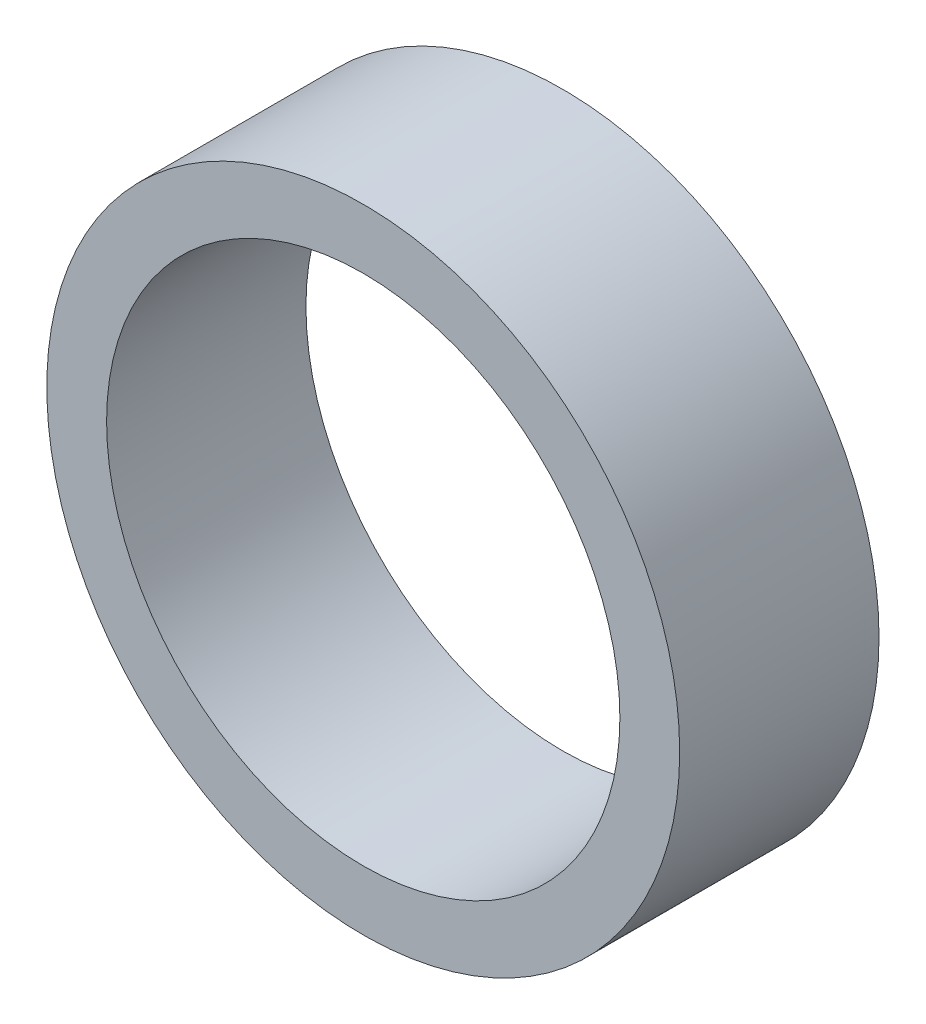
ISO-10303-21;
HEADER;
FILE_DESCRIPTION(('STEP AP214'),'2;1');
FILE_NAME('part.step','',(''),(''),'','','');
FILE_SCHEMA(('AUTOMOTIVE_DESIGN { 1 0 10303 214 1 1 1 1 }'));
ENDSEC;
DATA;
#1=APPLICATION_CONTEXT('core data for automotive mechanical design processes');
#2=APPLICATION_PROTOCOL_DEFINITION('international standard','automotive_design',2000,#1);
#3=PRODUCT_CONTEXT('',#1,'mechanical');
#4=PRODUCT('Part','Part','',(#3));
#5=PRODUCT_RELATED_PRODUCT_CATEGORY('part','',(#4));
#6=PRODUCT_DEFINITION_FORMATION('','',#4);
#7=PRODUCT_DEFINITION_CONTEXT('part definition',#1,'design');
#8=PRODUCT_DEFINITION('design','',#6,#7);
#9=PRODUCT_DEFINITION_SHAPE('','',#8);
#10=(LENGTH_UNIT() NAMED_UNIT(*) SI_UNIT(.MILLI.,.METRE.));
#11=(NAMED_UNIT(*) PLANE_ANGLE_UNIT() SI_UNIT($,.RADIAN.));
#12=(NAMED_UNIT(*) SI_UNIT($,.STERADIAN.) SOLID_ANGLE_UNIT());
#13=UNCERTAINTY_MEASURE_WITH_UNIT(LENGTH_MEASURE(1.E-05),#10,'distance_accuracy_value','');
#14=(GEOMETRIC_REPRESENTATION_CONTEXT(3) GLOBAL_UNCERTAINTY_ASSIGNED_CONTEXT((#13)) GLOBAL_UNIT_ASSIGNED_CONTEXT((#10,
#11,#12)) REPRESENTATION_CONTEXT('',''));
#15=CARTESIAN_POINT('',(0.,0.,0.));
#16=DIRECTION('',(0.,0.,1.));
#17=DIRECTION('',(1.,0.,0.));
#18=AXIS2_PLACEMENT_3D('',#15,#16,#17);
#19=CARTESIAN_POINT('',(0.,0.,4.));
#20=DIRECTION('',(0.,0.,1.));
#21=DIRECTION('',(1.,0.,0.));
#22=AXIS2_PLACEMENT_3D('',#19,#20,#21);
#23=PLANE('',#22);
#24=CARTESIAN_POINT('',(0.,0.,4.));
#25=DIRECTION('',(0.,0.,1.));
#26=DIRECTION('',(1.,0.,0.));
#27=AXIS2_PLACEMENT_3D('',#24,#25,#26);
#28=CIRCLE('',#27,6.35);
#29=CARTESIAN_POINT('',(6.35,0.,4.));
#30=VERTEX_POINT('',#29);
#31=EDGE_CURVE('E10',#30,#30,#28,.T.);
#32=ORIENTED_EDGE('',*,*,#31,.T.);
#33=EDGE_LOOP('',(#32));
#34=FACE_BOUND('',#33,.T.);
#35=CARTESIAN_POINT('',(0.,0.,4.));
#36=DIRECTION('',(0.,0.,1.));
#37=DIRECTION('',(1.,0.,0.));
#38=AXIS2_PLACEMENT_3D('',#35,#36,#37);
#39=CIRCLE('',#38,5.15);
#40=CARTESIAN_POINT('',(5.15,0.,4.));
#41=VERTEX_POINT('',#40);
#42=EDGE_CURVE('E44',#41,#41,#39,.T.);
#43=ORIENTED_EDGE('',*,*,#42,.F.);
#44=EDGE_LOOP('',(#43));
#45=FACE_BOUND('',#44,.T.);
#46=ADVANCED_FACE('F33',(#34,#45),#23,.T.);
#47=CARTESIAN_POINT('',(0.,0.,0.));
#48=DIRECTION('',(0.,0.,1.));
#49=DIRECTION('',(1.,0.,0.));
#50=AXIS2_PLACEMENT_3D('',#47,#48,#49);
#51=PLANE('',#50);
#52=CARTESIAN_POINT('',(0.,0.,0.));
#53=DIRECTION('',(0.,0.,1.));
#54=DIRECTION('',(1.,0.,0.));
#55=AXIS2_PLACEMENT_3D('',#52,#53,#54);
#56=CIRCLE('',#55,6.35);
#57=CARTESIAN_POINT('',(6.35,0.,0.));
#58=VERTEX_POINT('',#57);
#59=EDGE_CURVE('E37',#58,#58,#56,.T.);
#60=ORIENTED_EDGE('',*,*,#59,.F.);
#61=EDGE_LOOP('',(#60));
#62=FACE_BOUND('',#61,.T.);
#63=CARTESIAN_POINT('',(0.,0.,0.));
#64=DIRECTION('',(0.,0.,1.));
#65=DIRECTION('',(1.,0.,0.));
#66=AXIS2_PLACEMENT_3D('',#63,#64,#65);
#67=CIRCLE('',#66,5.15);
#68=CARTESIAN_POINT('',(5.15,0.,0.));
#69=VERTEX_POINT('',#68);
#70=EDGE_CURVE('E46',#69,#69,#67,.T.);
#71=ORIENTED_EDGE('',*,*,#70,.T.);
#72=EDGE_LOOP('',(#71));
#73=FACE_BOUND('',#72,.T.);
#74=ADVANCED_FACE('F56',(#62,#73),#51,.F.);
#75=CARTESIAN_POINT('',(0.,0.,4.));
#76=DIRECTION('',(0.,0.,-1.));
#77=DIRECTION('',(-1.,0.,0.));
#78=AXIS2_PLACEMENT_3D('',#75,#76,#77);
#79=CYLINDRICAL_SURFACE('',#78,6.35);
#80=ORIENTED_EDGE('',*,*,#31,.F.);
#81=EDGE_LOOP('',(#80));
#82=FACE_BOUND('',#81,.T.);
#83=ORIENTED_EDGE('',*,*,#59,.T.);
#84=EDGE_LOOP('',(#83));
#85=FACE_BOUND('',#84,.T.);
#86=ADVANCED_FACE('F35',(#82,#85),#79,.T.);
#87=CARTESIAN_POINT('',(0.,0.,4.));
#88=DIRECTION('',(0.,0.,-1.));
#89=DIRECTION('',(-1.,0.,0.));
#90=AXIS2_PLACEMENT_3D('',#87,#88,#89);
#91=CYLINDRICAL_SURFACE('',#90,5.15);
#92=ORIENTED_EDGE('',*,*,#42,.T.);
#93=EDGE_LOOP('',(#92));
#94=FACE_BOUND('',#93,.T.);
#95=ORIENTED_EDGE('',*,*,#70,.F.);
#96=EDGE_LOOP('',(#95));
#97=FACE_BOUND('',#96,.T.);
#98=ADVANCED_FACE('F52',(#94,#97),#91,.F.);
#99=CLOSED_SHELL('',(#46,#74,#86,#98));
#100=MANIFOLD_SOLID_BREP('B2',#99);
#101=ADVANCED_BREP_SHAPE_REPRESENTATION('',(#18,#100),#14);
#102=SHAPE_DEFINITION_REPRESENTATION(#9,#101);
ENDSEC;
END-ISO-10303-21;
